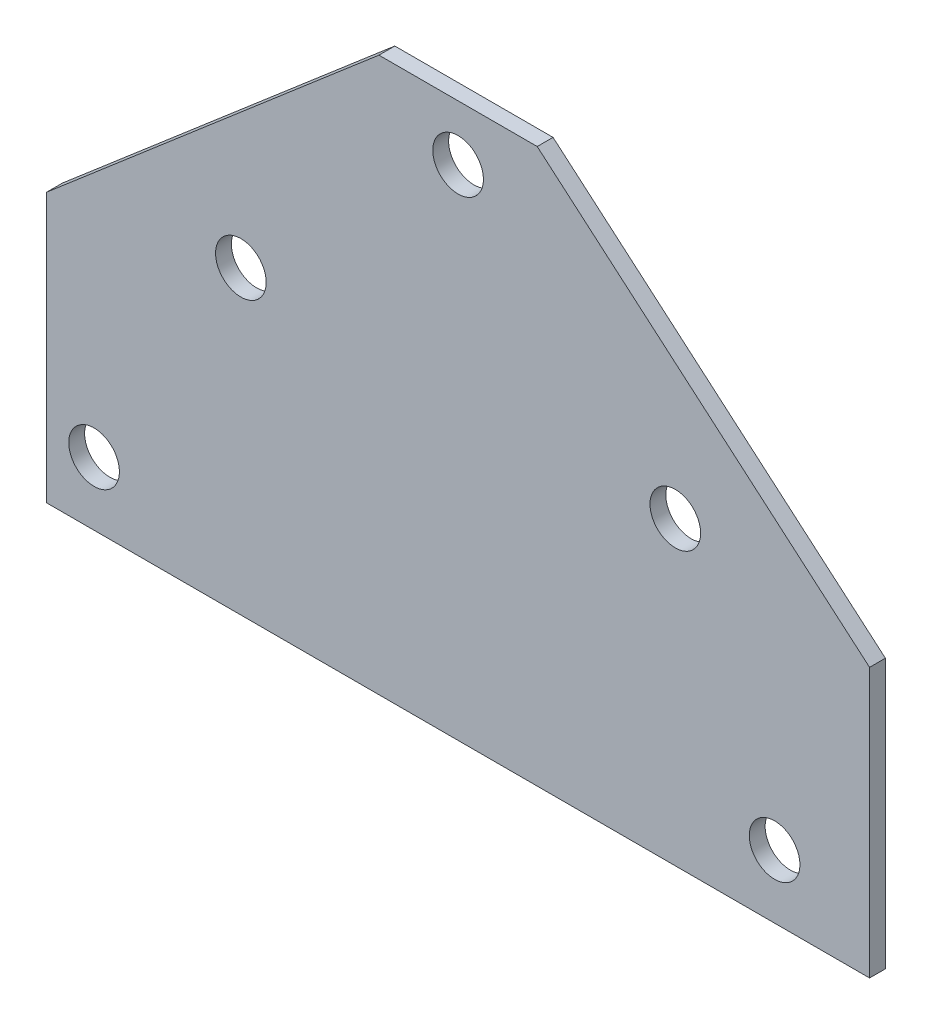
ISO-10303-21;
HEADER;
FILE_DESCRIPTION(('STEP AP214'),'2;1');
FILE_NAME('part.step','',(''),(''),'','','');
FILE_SCHEMA(('AUTOMOTIVE_DESIGN { 1 0 10303 214 1 1 1 1 }'));
ENDSEC;
DATA;
#1=APPLICATION_CONTEXT('core data for automotive mechanical design processes');
#2=APPLICATION_PROTOCOL_DEFINITION('international standard','automotive_design',2000,#1);
#3=PRODUCT_CONTEXT('',#1,'mechanical');
#4=PRODUCT('Part','Part','',(#3));
#5=PRODUCT_RELATED_PRODUCT_CATEGORY('part','',(#4));
#6=PRODUCT_DEFINITION_FORMATION('','',#4);
#7=PRODUCT_DEFINITION_CONTEXT('part definition',#1,'design');
#8=PRODUCT_DEFINITION('design','',#6,#7);
#9=PRODUCT_DEFINITION_SHAPE('','',#8);
#10=(LENGTH_UNIT() NAMED_UNIT(*) SI_UNIT(.MILLI.,.METRE.));
#11=(NAMED_UNIT(*) PLANE_ANGLE_UNIT() SI_UNIT($,.RADIAN.));
#12=(NAMED_UNIT(*) SI_UNIT($,.STERADIAN.) SOLID_ANGLE_UNIT());
#13=UNCERTAINTY_MEASURE_WITH_UNIT(LENGTH_MEASURE(1.E-05),#10,'distance_accuracy_value','');
#14=(GEOMETRIC_REPRESENTATION_CONTEXT(3) GLOBAL_UNCERTAINTY_ASSIGNED_CONTEXT((#13)) GLOBAL_UNIT_ASSIGNED_CONTEXT((#10,
#11,#12)) REPRESENTATION_CONTEXT('',''));
#15=CARTESIAN_POINT('',(0.,0.,0.));
#16=DIRECTION('',(0.,0.,1.));
#17=DIRECTION('',(1.,0.,0.));
#18=AXIS2_PLACEMENT_3D('',#15,#16,#17);
#19=CARTESIAN_POINT('',(0.,0.,1.));
#20=DIRECTION('',(0.,0.,-1.));
#21=DIRECTION('',(-1.,0.,0.));
#22=AXIS2_PLACEMENT_3D('',#19,#20,#21);
#23=PLANE('',#22);
#24=DIRECTION('',(0.,-1.,0.));
#25=VECTOR('',#24,1.);
#26=CARTESIAN_POINT('',(-26.,0.,1.));
#27=LINE('',#26,#25);
#28=CARTESIAN_POINT('',(-26.,17.,1.));
#29=VERTEX_POINT('',#28);
#30=CARTESIAN_POINT('',(-26.,0.,1.));
#31=VERTEX_POINT('',#30);
#32=EDGE_CURVE('E130',#29,#31,#27,.T.);
#33=ORIENTED_EDGE('',*,*,#32,.T.);
#34=DIRECTION('',(1.,0.,0.));
#35=VECTOR('',#34,1.);
#36=CARTESIAN_POINT('',(26.,0.,1.));
#37=LINE('',#36,#35);
#38=CARTESIAN_POINT('',(26.,0.,1.));
#39=VERTEX_POINT('',#38);
#40=EDGE_CURVE('E88',#31,#39,#37,.T.);
#41=ORIENTED_EDGE('',*,*,#40,.T.);
#42=DIRECTION('',(0.,1.,0.));
#43=VECTOR('',#42,1.);
#44=CARTESIAN_POINT('',(26.,0.,1.));
#45=LINE('',#44,#43);
#46=CARTESIAN_POINT('',(26.,17.,1.));
#47=VERTEX_POINT('',#46);
#48=EDGE_CURVE('E101',#39,#47,#45,.T.);
#49=ORIENTED_EDGE('',*,*,#48,.T.);
#50=DIRECTION('',(-0.759256602365297,0.650791373455968,0.));
#51=VECTOR('',#50,1.);
#52=CARTESIAN_POINT('',(26.,17.,1.));
#53=LINE('',#52,#51);
#54=CARTESIAN_POINT('',(5.,35.,1.));
#55=VERTEX_POINT('',#54);
#56=EDGE_CURVE('E95',#47,#55,#53,.T.);
#57=ORIENTED_EDGE('',*,*,#56,.T.);
#58=DIRECTION('',(-1.,0.,0.));
#59=VECTOR('',#58,1.);
#60=CARTESIAN_POINT('',(-5.,35.,1.));
#61=LINE('',#60,#59);
#62=CARTESIAN_POINT('',(-5.,35.,1.));
#63=VERTEX_POINT('',#62);
#64=EDGE_CURVE('E99',#55,#63,#61,.T.);
#65=ORIENTED_EDGE('',*,*,#64,.T.);
#66=DIRECTION('',(-0.759256602365296,-0.650791373455969,0.));
#67=VECTOR('',#66,1.);
#68=CARTESIAN_POINT('',(-26.,17.,1.));
#69=LINE('',#68,#67);
#70=EDGE_CURVE('E51',#63,#29,#69,.T.);
#71=ORIENTED_EDGE('',*,*,#70,.T.);
#72=EDGE_LOOP('',(#33,#41,#49,#57,#65,#71));
#73=FACE_BOUND('',#72,.T.);
#74=CARTESIAN_POINT('',(-13.725,19.,1.));
#75=DIRECTION('',(0.,0.,1.));
#76=DIRECTION('',(1.,0.,0.));
#77=AXIS2_PLACEMENT_3D('',#74,#75,#76);
#78=CIRCLE('',#77,1.6);
#79=CARTESIAN_POINT('',(-12.125,19.,1.));
#80=VERTEX_POINT('',#79);
#81=EDGE_CURVE('E123',#80,#80,#78,.T.);
#82=ORIENTED_EDGE('',*,*,#81,.F.);
#83=EDGE_LOOP('',(#82));
#84=FACE_BOUND('',#83,.T.);
#85=CARTESIAN_POINT('',(13.725,19.,1.));
#86=DIRECTION('',(0.,0.,1.));
#87=DIRECTION('',(-1.,0.,0.));
#88=AXIS2_PLACEMENT_3D('',#85,#86,#87);
#89=CIRCLE('',#88,1.6);
#90=CARTESIAN_POINT('',(12.125,19.,1.));
#91=VERTEX_POINT('',#90);
#92=EDGE_CURVE('E204',#91,#91,#89,.T.);
#93=ORIENTED_EDGE('',*,*,#92,.F.);
#94=EDGE_LOOP('',(#93));
#95=FACE_BOUND('',#94,.T.);
#96=CARTESIAN_POINT('',(-23.,3.99999999999999,1.));
#97=DIRECTION('',(0.,0.,1.));
#98=DIRECTION('',(1.,0.,0.));
#99=AXIS2_PLACEMENT_3D('',#96,#97,#98);
#100=CIRCLE('',#99,1.6);
#101=CARTESIAN_POINT('',(-21.4,3.99999999999999,1.));
#102=VERTEX_POINT('',#101);
#103=EDGE_CURVE('E198',#102,#102,#100,.T.);
#104=ORIENTED_EDGE('',*,*,#103,.F.);
#105=EDGE_LOOP('',(#104));
#106=FACE_BOUND('',#105,.T.);
#107=CARTESIAN_POINT('',(20.,3.99999999999999,1.));
#108=DIRECTION('',(0.,0.,1.));
#109=DIRECTION('',(-1.,0.,0.));
#110=AXIS2_PLACEMENT_3D('',#107,#108,#109);
#111=CIRCLE('',#110,1.6);
#112=CARTESIAN_POINT('',(18.4,3.99999999999999,1.));
#113=VERTEX_POINT('',#112);
#114=EDGE_CURVE('E192',#113,#113,#111,.T.);
#115=ORIENTED_EDGE('',*,*,#114,.F.);
#116=EDGE_LOOP('',(#115));
#117=FACE_BOUND('',#116,.T.);
#118=CARTESIAN_POINT('',(1.10659543987132E-13,31.5,1.));
#119=DIRECTION('',(0.,0.,1.));
#120=DIRECTION('',(1.,0.,0.));
#121=AXIS2_PLACEMENT_3D('',#118,#119,#120);
#122=CIRCLE('',#121,1.6);
#123=CARTESIAN_POINT('',(1.60000000000011,31.5,1.));
#124=VERTEX_POINT('',#123);
#125=EDGE_CURVE('E183',#124,#124,#122,.T.);
#126=ORIENTED_EDGE('',*,*,#125,.F.);
#127=EDGE_LOOP('',(#126));
#128=FACE_BOUND('',#127,.T.);
#129=ADVANCED_FACE('F34',(#73,#84,#95,#106,#117,#128),#23,.F.);
#130=CARTESIAN_POINT('',(0.,0.,0.));
#131=DIRECTION('',(0.,0.,-1.));
#132=DIRECTION('',(-1.,0.,0.));
#133=AXIS2_PLACEMENT_3D('',#130,#131,#132);
#134=PLANE('',#133);
#135=CARTESIAN_POINT('',(20.,3.99999999999999,0.));
#136=DIRECTION('',(0.,0.,1.));
#137=DIRECTION('',(-1.,0.,0.));
#138=AXIS2_PLACEMENT_3D('',#135,#136,#137);
#139=CIRCLE('',#138,1.6);
#140=CARTESIAN_POINT('',(18.4,3.99999999999999,0.));
#141=VERTEX_POINT('',#140);
#142=EDGE_CURVE('E189',#141,#141,#139,.T.);
#143=ORIENTED_EDGE('',*,*,#142,.T.);
#144=EDGE_LOOP('',(#143));
#145=FACE_BOUND('',#144,.T.);
#146=CARTESIAN_POINT('',(13.725,19.,0.));
#147=DIRECTION('',(0.,0.,1.));
#148=DIRECTION('',(-1.,0.,0.));
#149=AXIS2_PLACEMENT_3D('',#146,#147,#148);
#150=CIRCLE('',#149,1.6);
#151=CARTESIAN_POINT('',(12.125,19.,0.));
#152=VERTEX_POINT('',#151);
#153=EDGE_CURVE('E201',#152,#152,#150,.T.);
#154=ORIENTED_EDGE('',*,*,#153,.T.);
#155=EDGE_LOOP('',(#154));
#156=FACE_BOUND('',#155,.T.);
#157=DIRECTION('',(0.,-1.,0.));
#158=VECTOR('',#157,1.);
#159=CARTESIAN_POINT('',(-26.,0.,0.));
#160=LINE('',#159,#158);
#161=CARTESIAN_POINT('',(-26.,17.,0.));
#162=VERTEX_POINT('',#161);
#163=CARTESIAN_POINT('',(-26.,0.,0.));
#164=VERTEX_POINT('',#163);
#165=EDGE_CURVE('E119',#162,#164,#160,.T.);
#166=ORIENTED_EDGE('',*,*,#165,.F.);
#167=DIRECTION('',(-0.759256602365296,-0.650791373455969,0.));
#168=VECTOR('',#167,1.);
#169=CARTESIAN_POINT('',(-26.,17.,0.));
#170=LINE('',#169,#168);
#171=CARTESIAN_POINT('',(-5.,35.,0.));
#172=VERTEX_POINT('',#171);
#173=EDGE_CURVE('E80',#172,#162,#170,.T.);
#174=ORIENTED_EDGE('',*,*,#173,.F.);
#175=DIRECTION('',(-1.,0.,0.));
#176=VECTOR('',#175,1.);
#177=CARTESIAN_POINT('',(-5.,35.,0.));
#178=LINE('',#177,#176);
#179=CARTESIAN_POINT('',(5.,35.,0.));
#180=VERTEX_POINT('',#179);
#181=EDGE_CURVE('E74',#180,#172,#178,.T.);
#182=ORIENTED_EDGE('',*,*,#181,.F.);
#183=DIRECTION('',(-0.759256602365297,0.650791373455968,0.));
#184=VECTOR('',#183,1.);
#185=CARTESIAN_POINT('',(26.,17.,0.));
#186=LINE('',#185,#184);
#187=CARTESIAN_POINT('',(26.,17.,0.));
#188=VERTEX_POINT('',#187);
#189=EDGE_CURVE('E109',#188,#180,#186,.T.);
#190=ORIENTED_EDGE('',*,*,#189,.F.);
#191=DIRECTION('',(0.,1.,0.));
#192=VECTOR('',#191,1.);
#193=CARTESIAN_POINT('',(26.,0.,0.));
#194=LINE('',#193,#192);
#195=CARTESIAN_POINT('',(26.,0.,0.));
#196=VERTEX_POINT('',#195);
#197=EDGE_CURVE('E125',#196,#188,#194,.T.);
#198=ORIENTED_EDGE('',*,*,#197,.F.);
#199=DIRECTION('',(1.,0.,0.));
#200=VECTOR('',#199,1.);
#201=CARTESIAN_POINT('',(26.,0.,0.));
#202=LINE('',#201,#200);
#203=EDGE_CURVE('E122',#164,#196,#202,.T.);
#204=ORIENTED_EDGE('',*,*,#203,.F.);
#205=EDGE_LOOP('',(#166,#174,#182,#190,#198,#204));
#206=FACE_BOUND('',#205,.T.);
#207=CARTESIAN_POINT('',(-13.725,19.,0.));
#208=DIRECTION('',(0.,0.,1.));
#209=DIRECTION('',(1.,0.,0.));
#210=AXIS2_PLACEMENT_3D('',#207,#208,#209);
#211=CIRCLE('',#210,1.6);
#212=CARTESIAN_POINT('',(-12.125,19.,0.));
#213=VERTEX_POINT('',#212);
#214=EDGE_CURVE('E207',#213,#213,#211,.T.);
#215=ORIENTED_EDGE('',*,*,#214,.T.);
#216=EDGE_LOOP('',(#215));
#217=FACE_BOUND('',#216,.T.);
#218=CARTESIAN_POINT('',(-23.,3.99999999999999,0.));
#219=DIRECTION('',(0.,0.,1.));
#220=DIRECTION('',(1.,0.,0.));
#221=AXIS2_PLACEMENT_3D('',#218,#219,#220);
#222=CIRCLE('',#221,1.6);
#223=CARTESIAN_POINT('',(-21.4,3.99999999999999,0.));
#224=VERTEX_POINT('',#223);
#225=EDGE_CURVE('E195',#224,#224,#222,.T.);
#226=ORIENTED_EDGE('',*,*,#225,.T.);
#227=EDGE_LOOP('',(#226));
#228=FACE_BOUND('',#227,.T.);
#229=CARTESIAN_POINT('',(1.10659543987132E-13,31.5,0.));
#230=DIRECTION('',(0.,0.,1.));
#231=DIRECTION('',(1.,0.,0.));
#232=AXIS2_PLACEMENT_3D('',#229,#230,#231);
#233=CIRCLE('',#232,1.6);
#234=CARTESIAN_POINT('',(1.60000000000011,31.5,0.));
#235=VERTEX_POINT('',#234);
#236=EDGE_CURVE('E186',#235,#235,#233,.T.);
#237=ORIENTED_EDGE('',*,*,#236,.T.);
#238=EDGE_LOOP('',(#237));
#239=FACE_BOUND('',#238,.T.);
#240=ADVANCED_FACE('F139',(#145,#156,#206,#217,#228,#239),#134,.T.);
#241=CARTESIAN_POINT('',(-26.,0.,1.));
#242=DIRECTION('',(1.,0.,0.));
#243=DIRECTION('',(0.,0.,-1.));
#244=AXIS2_PLACEMENT_3D('',#241,#242,#243);
#245=PLANE('',#244);
#246=ORIENTED_EDGE('',*,*,#165,.T.);
#247=DIRECTION('',(0.,0.,-1.));
#248=VECTOR('',#247,1.);
#249=CARTESIAN_POINT('',(-26.,0.,1.));
#250=LINE('',#249,#248);
#251=EDGE_CURVE('E11',#31,#164,#250,.T.);
#252=ORIENTED_EDGE('',*,*,#251,.F.);
#253=ORIENTED_EDGE('',*,*,#32,.F.);
#254=DIRECTION('',(0.,0.,-1.));
#255=VECTOR('',#254,1.);
#256=CARTESIAN_POINT('',(-26.,17.,1.));
#257=LINE('',#256,#255);
#258=EDGE_CURVE('E115',#29,#162,#257,.T.);
#259=ORIENTED_EDGE('',*,*,#258,.T.);
#260=EDGE_LOOP('',(#246,#252,#253,#259));
#261=FACE_BOUND('',#260,.T.);
#262=ADVANCED_FACE('F36',(#261),#245,.F.);
#263=CARTESIAN_POINT('',(26.,0.,1.));
#264=DIRECTION('',(0.,1.,0.));
#265=DIRECTION('',(-1.,0.,0.));
#266=AXIS2_PLACEMENT_3D('',#263,#264,#265);
#267=PLANE('',#266);
#268=ORIENTED_EDGE('',*,*,#203,.T.);
#269=DIRECTION('',(0.,0.,-1.));
#270=VECTOR('',#269,1.);
#271=CARTESIAN_POINT('',(26.,0.,1.));
#272=LINE('',#271,#270);
#273=EDGE_CURVE('E43',#39,#196,#272,.T.);
#274=ORIENTED_EDGE('',*,*,#273,.F.);
#275=ORIENTED_EDGE('',*,*,#40,.F.);
#276=ORIENTED_EDGE('',*,*,#251,.T.);
#277=EDGE_LOOP('',(#268,#274,#275,#276));
#278=FACE_BOUND('',#277,.T.);
#279=ADVANCED_FACE('F276',(#278),#267,.F.);
#280=CARTESIAN_POINT('',(26.,0.,1.));
#281=DIRECTION('',(-1.,0.,0.));
#282=DIRECTION('',(0.,0.,1.));
#283=AXIS2_PLACEMENT_3D('',#280,#281,#282);
#284=PLANE('',#283);
#285=ORIENTED_EDGE('',*,*,#197,.T.);
#286=DIRECTION('',(0.,0.,-1.));
#287=VECTOR('',#286,1.);
#288=CARTESIAN_POINT('',(26.,17.,1.));
#289=LINE('',#288,#287);
#290=EDGE_CURVE('E110',#47,#188,#289,.T.);
#291=ORIENTED_EDGE('',*,*,#290,.F.);
#292=ORIENTED_EDGE('',*,*,#48,.F.);
#293=ORIENTED_EDGE('',*,*,#273,.T.);
#294=EDGE_LOOP('',(#285,#291,#292,#293));
#295=FACE_BOUND('',#294,.T.);
#296=ADVANCED_FACE('F136',(#295),#284,.F.);
#297=CARTESIAN_POINT('',(26.,17.,1.));
#298=DIRECTION('',(-0.650791373455968,-0.759256602365297,0.));
#299=DIRECTION('',(0.759256602365297,-0.650791373455968,0.));
#300=AXIS2_PLACEMENT_3D('',#297,#298,#299);
#301=PLANE('',#300);
#302=ORIENTED_EDGE('',*,*,#189,.T.);
#303=DIRECTION('',(0.,0.,-1.));
#304=VECTOR('',#303,1.);
#305=CARTESIAN_POINT('',(5.,35.,1.));
#306=LINE('',#305,#304);
#307=EDGE_CURVE('E106',#55,#180,#306,.T.);
#308=ORIENTED_EDGE('',*,*,#307,.F.);
#309=ORIENTED_EDGE('',*,*,#56,.F.);
#310=ORIENTED_EDGE('',*,*,#290,.T.);
#311=EDGE_LOOP('',(#302,#308,#309,#310));
#312=FACE_BOUND('',#311,.T.);
#313=ADVANCED_FACE('F107',(#312),#301,.F.);
#314=CARTESIAN_POINT('',(-5.,35.,1.));
#315=DIRECTION('',(0.,-1.,0.));
#316=DIRECTION('',(0.,0.,-1.));
#317=AXIS2_PLACEMENT_3D('',#314,#315,#316);
#318=PLANE('',#317);
#319=ORIENTED_EDGE('',*,*,#181,.T.);
#320=DIRECTION('',(0.,0.,-1.));
#321=VECTOR('',#320,1.);
#322=CARTESIAN_POINT('',(-5.,35.,1.));
#323=LINE('',#322,#321);
#324=EDGE_CURVE('E111',#63,#172,#323,.T.);
#325=ORIENTED_EDGE('',*,*,#324,.F.);
#326=ORIENTED_EDGE('',*,*,#64,.F.);
#327=ORIENTED_EDGE('',*,*,#307,.T.);
#328=EDGE_LOOP('',(#319,#325,#326,#327));
#329=FACE_BOUND('',#328,.T.);
#330=ADVANCED_FACE('F113',(#329),#318,.F.);
#331=CARTESIAN_POINT('',(-26.,17.,1.));
#332=DIRECTION('',(0.650791373455969,-0.759256602365296,0.));
#333=DIRECTION('',(0.759256602365296,0.650791373455969,0.));
#334=AXIS2_PLACEMENT_3D('',#331,#332,#333);
#335=PLANE('',#334);
#336=ORIENTED_EDGE('',*,*,#173,.T.);
#337=ORIENTED_EDGE('',*,*,#258,.F.);
#338=ORIENTED_EDGE('',*,*,#70,.F.);
#339=ORIENTED_EDGE('',*,*,#324,.T.);
#340=EDGE_LOOP('',(#336,#337,#338,#339));
#341=FACE_BOUND('',#340,.T.);
#342=ADVANCED_FACE('F144',(#341),#335,.F.);
#343=CARTESIAN_POINT('',(-13.725,19.,1.));
#344=DIRECTION('',(0.,0.,-1.));
#345=DIRECTION('',(-1.,0.,0.));
#346=AXIS2_PLACEMENT_3D('',#343,#344,#345);
#347=CYLINDRICAL_SURFACE('',#346,1.6);
#348=ORIENTED_EDGE('',*,*,#81,.T.);
#349=EDGE_LOOP('',(#348));
#350=FACE_BOUND('',#349,.T.);
#351=ORIENTED_EDGE('',*,*,#214,.F.);
#352=EDGE_LOOP('',(#351));
#353=FACE_BOUND('',#352,.T.);
#354=ADVANCED_FACE('F146',(#350,#353),#347,.F.);
#355=CARTESIAN_POINT('',(13.725,19.,1.));
#356=DIRECTION('',(0.,0.,-1.));
#357=DIRECTION('',(-1.,0.,0.));
#358=AXIS2_PLACEMENT_3D('',#355,#356,#357);
#359=CYLINDRICAL_SURFACE('',#358,1.6);
#360=ORIENTED_EDGE('',*,*,#92,.T.);
#361=EDGE_LOOP('',(#360));
#362=FACE_BOUND('',#361,.T.);
#363=ORIENTED_EDGE('',*,*,#153,.F.);
#364=EDGE_LOOP('',(#363));
#365=FACE_BOUND('',#364,.T.);
#366=ADVANCED_FACE('F152',(#362,#365),#359,.F.);
#367=CARTESIAN_POINT('',(-23.,3.99999999999999,1.));
#368=DIRECTION('',(0.,0.,-1.));
#369=DIRECTION('',(-1.,0.,0.));
#370=AXIS2_PLACEMENT_3D('',#367,#368,#369);
#371=CYLINDRICAL_SURFACE('',#370,1.6);
#372=ORIENTED_EDGE('',*,*,#103,.T.);
#373=EDGE_LOOP('',(#372));
#374=FACE_BOUND('',#373,.T.);
#375=ORIENTED_EDGE('',*,*,#225,.F.);
#376=EDGE_LOOP('',(#375));
#377=FACE_BOUND('',#376,.T.);
#378=ADVANCED_FACE('F166',(#374,#377),#371,.F.);
#379=CARTESIAN_POINT('',(20.,3.99999999999999,1.));
#380=DIRECTION('',(0.,0.,-1.));
#381=DIRECTION('',(-1.,0.,0.));
#382=AXIS2_PLACEMENT_3D('',#379,#380,#381);
#383=CYLINDRICAL_SURFACE('',#382,1.6);
#384=ORIENTED_EDGE('',*,*,#114,.T.);
#385=EDGE_LOOP('',(#384));
#386=FACE_BOUND('',#385,.T.);
#387=ORIENTED_EDGE('',*,*,#142,.F.);
#388=EDGE_LOOP('',(#387));
#389=FACE_BOUND('',#388,.T.);
#390=ADVANCED_FACE('F170',(#386,#389),#383,.F.);
#391=CARTESIAN_POINT('',(1.10659543987132E-13,31.5,1.));
#392=DIRECTION('',(0.,0.,-1.));
#393=DIRECTION('',(-1.,0.,0.));
#394=AXIS2_PLACEMENT_3D('',#391,#392,#393);
#395=CYLINDRICAL_SURFACE('',#394,1.6);
#396=ORIENTED_EDGE('',*,*,#125,.T.);
#397=EDGE_LOOP('',(#396));
#398=FACE_BOUND('',#397,.T.);
#399=ORIENTED_EDGE('',*,*,#236,.F.);
#400=EDGE_LOOP('',(#399));
#401=FACE_BOUND('',#400,.T.);
#402=ADVANCED_FACE('F174',(#398,#401),#395,.F.);
#403=CLOSED_SHELL('',(#129,#240,#262,#279,#296,#313,#330,#342,#354,#366,#378,#390,#402));
#404=MANIFOLD_SOLID_BREP('B2',#403);
#405=ADVANCED_BREP_SHAPE_REPRESENTATION('',(#18,#404),#14);
#406=SHAPE_DEFINITION_REPRESENTATION(#9,#405);
ENDSEC;
END-ISO-10303-21;
